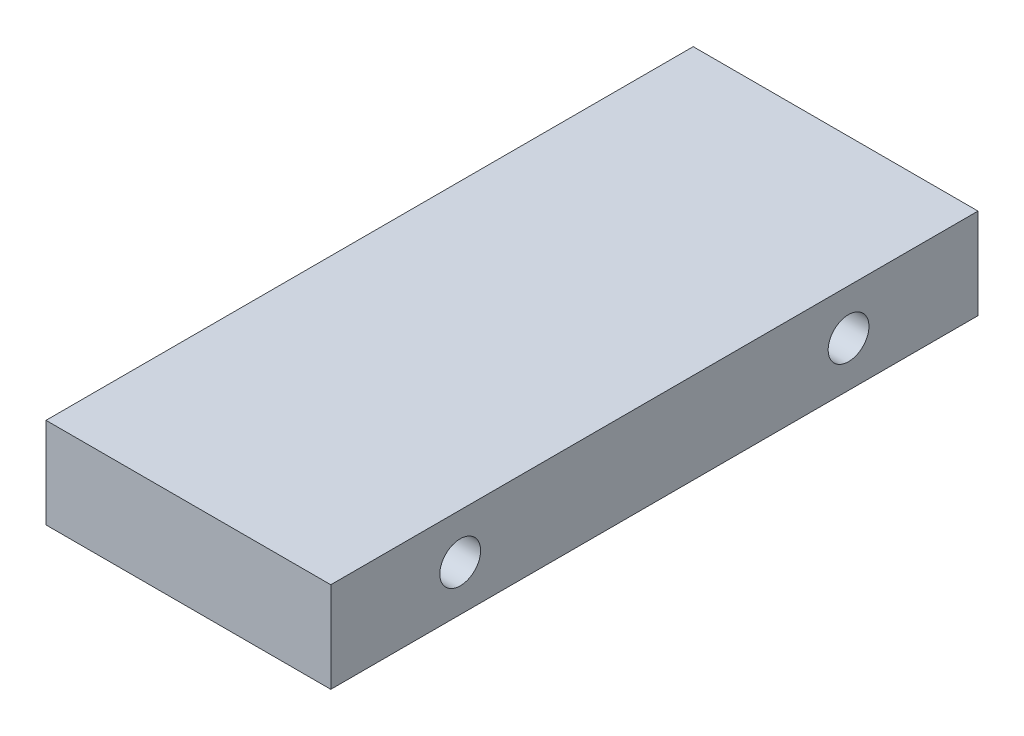
ISO-10303-21;
HEADER;
FILE_DESCRIPTION(('STEP AP214'),'2;1');
FILE_NAME('part.step','',(''),(''),'','','');
FILE_SCHEMA(('AUTOMOTIVE_DESIGN { 1 0 10303 214 1 1 1 1 }'));
ENDSEC;
DATA;
#1=APPLICATION_CONTEXT('core data for automotive mechanical design processes');
#2=APPLICATION_PROTOCOL_DEFINITION('international standard','automotive_design',2000,#1);
#3=PRODUCT_CONTEXT('',#1,'mechanical');
#4=PRODUCT('Part','Part','',(#3));
#5=PRODUCT_RELATED_PRODUCT_CATEGORY('part','',(#4));
#6=PRODUCT_DEFINITION_FORMATION('','',#4);
#7=PRODUCT_DEFINITION_CONTEXT('part definition',#1,'design');
#8=PRODUCT_DEFINITION('design','',#6,#7);
#9=PRODUCT_DEFINITION_SHAPE('','',#8);
#10=(LENGTH_UNIT() NAMED_UNIT(*) SI_UNIT(.MILLI.,.METRE.));
#11=(NAMED_UNIT(*) PLANE_ANGLE_UNIT() SI_UNIT($,.RADIAN.));
#12=(NAMED_UNIT(*) SI_UNIT($,.STERADIAN.) SOLID_ANGLE_UNIT());
#13=UNCERTAINTY_MEASURE_WITH_UNIT(LENGTH_MEASURE(1.E-05),#10,'distance_accuracy_value','');
#14=(GEOMETRIC_REPRESENTATION_CONTEXT(3) GLOBAL_UNCERTAINTY_ASSIGNED_CONTEXT((#13)) GLOBAL_UNIT_ASSIGNED_CONTEXT((#10,
#11,#12)) REPRESENTATION_CONTEXT('',''));
#15=CARTESIAN_POINT('',(0.,0.,0.));
#16=DIRECTION('',(0.,0.,1.));
#17=DIRECTION('',(1.,0.,0.));
#18=AXIS2_PLACEMENT_3D('',#15,#16,#17);
#19=CARTESIAN_POINT('',(22.,3.64364010352587,45.2762342197771));
#20=DIRECTION('',(0.,0.,-1.));
#21=DIRECTION('',(-1.,0.,0.));
#22=AXIS2_PLACEMENT_3D('',#19,#20,#21);
#23=PLANE('',#22);
#24=DIRECTION('',(0.,-1.,0.));
#25=VECTOR('',#24,1.);
#26=CARTESIAN_POINT('',(0.,3.64364010352587,45.2762342197771));
#27=LINE('',#26,#25);
#28=CARTESIAN_POINT('',(0.,3.64364010352587,45.2762342197771));
#29=VERTEX_POINT('',#28);
#30=CARTESIAN_POINT('',(0.,-3.35635989647414,45.2762342197771));
#31=VERTEX_POINT('',#30);
#32=EDGE_CURVE('E117',#29,#31,#27,.T.);
#33=ORIENTED_EDGE('',*,*,#32,.T.);
#34=DIRECTION('',(-1.,0.,0.));
#35=VECTOR('',#34,1.);
#36=CARTESIAN_POINT('',(22.,-3.35635989647414,45.2762342197771));
#37=LINE('',#36,#35);
#38=CARTESIAN_POINT('',(22.,-3.35635989647414,45.2762342197771));
#39=VERTEX_POINT('',#38);
#40=EDGE_CURVE('E11',#39,#31,#37,.T.);
#41=ORIENTED_EDGE('',*,*,#40,.F.);
#42=DIRECTION('',(0.,-1.,0.));
#43=VECTOR('',#42,1.);
#44=CARTESIAN_POINT('',(22.,3.64364010352587,45.2762342197771));
#45=LINE('',#44,#43);
#46=CARTESIAN_POINT('',(22.,3.64364010352587,45.2762342197771));
#47=VERTEX_POINT('',#46);
#48=EDGE_CURVE('E118',#47,#39,#45,.T.);
#49=ORIENTED_EDGE('',*,*,#48,.F.);
#50=DIRECTION('',(-1.,0.,0.));
#51=VECTOR('',#50,1.);
#52=CARTESIAN_POINT('',(22.,3.64364010352587,45.2762342197771));
#53=LINE('',#52,#51);
#54=EDGE_CURVE('E124',#47,#29,#53,.T.);
#55=ORIENTED_EDGE('',*,*,#54,.T.);
#56=EDGE_LOOP('',(#33,#41,#49,#55));
#57=FACE_BOUND('',#56,.T.);
#58=ADVANCED_FACE('F33',(#57),#23,.F.);
#59=CARTESIAN_POINT('',(22.,-3.35635989647414,45.2762342197771));
#60=DIRECTION('',(0.,1.,0.));
#61=DIRECTION('',(0.,0.,1.));
#62=AXIS2_PLACEMENT_3D('',#59,#60,#61);
#63=PLANE('',#62);
#64=DIRECTION('',(0.,0.,-1.));
#65=VECTOR('',#64,1.);
#66=CARTESIAN_POINT('',(0.,-3.35635989647414,45.2762342197771));
#67=LINE('',#66,#65);
#68=CARTESIAN_POINT('',(0.,-3.35635989647413,-4.72376578022288));
#69=VERTEX_POINT('',#68);
#70=EDGE_CURVE('E127',#31,#69,#67,.T.);
#71=ORIENTED_EDGE('',*,*,#70,.T.);
#72=DIRECTION('',(-1.,0.,0.));
#73=VECTOR('',#72,1.);
#74=CARTESIAN_POINT('',(22.,-3.35635989647413,-4.72376578022288));
#75=LINE('',#74,#73);
#76=CARTESIAN_POINT('',(22.,-3.35635989647413,-4.72376578022288));
#77=VERTEX_POINT('',#76);
#78=EDGE_CURVE('E41',#77,#69,#75,.T.);
#79=ORIENTED_EDGE('',*,*,#78,.F.);
#80=DIRECTION('',(0.,0.,-1.));
#81=VECTOR('',#80,1.);
#82=CARTESIAN_POINT('',(22.,-3.35635989647414,45.2762342197771));
#83=LINE('',#82,#81);
#84=EDGE_CURVE('E80',#39,#77,#83,.T.);
#85=ORIENTED_EDGE('',*,*,#84,.F.);
#86=ORIENTED_EDGE('',*,*,#40,.T.);
#87=EDGE_LOOP('',(#71,#79,#85,#86));
#88=FACE_BOUND('',#87,.T.);
#89=ADVANCED_FACE('F151',(#88),#63,.F.);
#90=CARTESIAN_POINT('',(22.,3.64364010352587,-4.72376578022288));
#91=DIRECTION('',(0.,0.,1.));
#92=DIRECTION('',(0.,-1.,0.));
#93=AXIS2_PLACEMENT_3D('',#90,#91,#92);
#94=PLANE('',#93);
#95=DIRECTION('',(0.,1.,0.));
#96=VECTOR('',#95,1.);
#97=CARTESIAN_POINT('',(0.,3.64364010352587,-4.72376578022288));
#98=LINE('',#97,#96);
#99=CARTESIAN_POINT('',(0.,3.64364010352587,-4.72376578022288));
#100=VERTEX_POINT('',#99);
#101=EDGE_CURVE('E67',#69,#100,#98,.T.);
#102=ORIENTED_EDGE('',*,*,#101,.T.);
#103=DIRECTION('',(-1.,0.,0.));
#104=VECTOR('',#103,1.);
#105=CARTESIAN_POINT('',(22.,3.64364010352587,-4.72376578022288));
#106=LINE('',#105,#104);
#107=CARTESIAN_POINT('',(22.,3.64364010352587,-4.72376578022288));
#108=VERTEX_POINT('',#107);
#109=EDGE_CURVE('E132',#108,#100,#106,.T.);
#110=ORIENTED_EDGE('',*,*,#109,.F.);
#111=DIRECTION('',(0.,1.,0.));
#112=VECTOR('',#111,1.);
#113=CARTESIAN_POINT('',(22.,3.64364010352587,-4.72376578022288));
#114=LINE('',#113,#112);
#115=EDGE_CURVE('E121',#77,#108,#114,.T.);
#116=ORIENTED_EDGE('',*,*,#115,.F.);
#117=ORIENTED_EDGE('',*,*,#78,.T.);
#118=EDGE_LOOP('',(#102,#110,#116,#117));
#119=FACE_BOUND('',#118,.T.);
#120=ADVANCED_FACE('F134',(#119),#94,.F.);
#121=CARTESIAN_POINT('',(22.,3.64364010352587,45.2762342197771));
#122=DIRECTION('',(0.,-1.,0.));
#123=DIRECTION('',(0.,0.,-1.));
#124=AXIS2_PLACEMENT_3D('',#121,#122,#123);
#125=PLANE('',#124);
#126=DIRECTION('',(0.,0.,1.));
#127=VECTOR('',#126,1.);
#128=CARTESIAN_POINT('',(0.,3.64364010352587,45.2762342197771));
#129=LINE('',#128,#127);
#130=EDGE_CURVE('E73',#100,#29,#129,.T.);
#131=ORIENTED_EDGE('',*,*,#130,.T.);
#132=ORIENTED_EDGE('',*,*,#54,.F.);
#133=DIRECTION('',(0.,0.,1.));
#134=VECTOR('',#133,1.);
#135=CARTESIAN_POINT('',(22.,3.64364010352587,45.2762342197771));
#136=LINE('',#135,#134);
#137=EDGE_CURVE('E49',#108,#47,#136,.T.);
#138=ORIENTED_EDGE('',*,*,#137,.F.);
#139=ORIENTED_EDGE('',*,*,#109,.T.);
#140=EDGE_LOOP('',(#131,#132,#138,#139));
#141=FACE_BOUND('',#140,.T.);
#142=ADVANCED_FACE('F141',(#141),#125,.F.);
#143=CARTESIAN_POINT('',(22.,0.,0.));
#144=DIRECTION('',(1.,0.,0.));
#145=DIRECTION('',(0.,0.,-1.));
#146=AXIS2_PLACEMENT_3D('',#143,#144,#145);
#147=PLANE('',#146);
#148=CARTESIAN_POINT('',(22.,0.143640103525865,35.2762342197771));
#149=DIRECTION('',(1.,0.,0.));
#150=DIRECTION('',(0.,0.,-1.));
#151=AXIS2_PLACEMENT_3D('',#148,#149,#150);
#152=CIRCLE('',#151,1.575);
#153=CARTESIAN_POINT('',(22.,0.143640103525865,33.7012342197771));
#154=VERTEX_POINT('',#153);
#155=EDGE_CURVE('E100',#154,#154,#152,.T.);
#156=ORIENTED_EDGE('',*,*,#155,.F.);
#157=EDGE_LOOP('',(#156));
#158=FACE_BOUND('',#157,.T.);
#159=CARTESIAN_POINT('',(22.,0.143640103525865,5.27623421977712));
#160=DIRECTION('',(1.,0.,0.));
#161=DIRECTION('',(0.,0.,-1.));
#162=AXIS2_PLACEMENT_3D('',#159,#160,#161);
#163=CIRCLE('',#162,1.575);
#164=CARTESIAN_POINT('',(22.,0.143640103525865,3.70123421977712));
#165=VERTEX_POINT('',#164);
#166=EDGE_CURVE('E111',#165,#165,#163,.T.);
#167=ORIENTED_EDGE('',*,*,#166,.F.);
#168=EDGE_LOOP('',(#167));
#169=FACE_BOUND('',#168,.T.);
#170=ORIENTED_EDGE('',*,*,#48,.T.);
#171=ORIENTED_EDGE('',*,*,#84,.T.);
#172=ORIENTED_EDGE('',*,*,#115,.T.);
#173=ORIENTED_EDGE('',*,*,#137,.T.);
#174=EDGE_LOOP('',(#170,#171,#172,#173));
#175=FACE_BOUND('',#174,.T.);
#176=ADVANCED_FACE('F143',(#158,#169,#175),#147,.T.);
#177=CARTESIAN_POINT('',(0.,0.,0.));
#178=DIRECTION('',(1.,0.,0.));
#179=DIRECTION('',(0.,0.,-1.));
#180=AXIS2_PLACEMENT_3D('',#177,#178,#179);
#181=PLANE('',#180);
#182=CARTESIAN_POINT('',(0.,0.143640103525865,20.2762342197771));
#183=DIRECTION('',(-1.,0.,0.));
#184=DIRECTION('',(0.,0.,1.));
#185=AXIS2_PLACEMENT_3D('',#182,#183,#184);
#186=CIRCLE('',#185,1.57499999999999);
#187=CARTESIAN_POINT('',(0.,0.143640103525865,21.8512342197771));
#188=VERTEX_POINT('',#187);
#189=EDGE_CURVE('E101',#188,#188,#186,.T.);
#190=ORIENTED_EDGE('',*,*,#189,.F.);
#191=EDGE_LOOP('',(#190));
#192=FACE_BOUND('',#191,.T.);
#193=ORIENTED_EDGE('',*,*,#32,.F.);
#194=ORIENTED_EDGE('',*,*,#130,.F.);
#195=ORIENTED_EDGE('',*,*,#101,.F.);
#196=ORIENTED_EDGE('',*,*,#70,.F.);
#197=EDGE_LOOP('',(#193,#194,#195,#196));
#198=FACE_BOUND('',#197,.T.);
#199=ADVANCED_FACE('F137',(#192,#198),#181,.F.);
#200=CARTESIAN_POINT('',(12.,0.143640103525865,5.27623421977712));
#201=DIRECTION('',(1.,0.,0.));
#202=DIRECTION('',(0.,0.,-1.));
#203=AXIS2_PLACEMENT_3D('',#200,#201,#202);
#204=CONICAL_SURFACE('',#203,1.575,1.02974425867665);
#205=CARTESIAN_POINT('',(11.0536445250316,0.143640103525862,5.27623421977712));
#206=VERTEX_POINT('',#205);
#207=VERTEX_LOOP('',#206);
#208=FACE_BOUND('',#207,.T.);
#209=CARTESIAN_POINT('',(12.,0.143640103525865,5.27623421977712));
#210=DIRECTION('',(1.,0.,0.));
#211=DIRECTION('',(0.,0.,-1.));
#212=AXIS2_PLACEMENT_3D('',#209,#210,#211);
#213=CIRCLE('',#212,1.575);
#214=CARTESIAN_POINT('',(12.,0.143640103525865,3.70123421977713));
#215=VERTEX_POINT('',#214);
#216=EDGE_CURVE('E114',#215,#215,#213,.T.);
#217=ORIENTED_EDGE('',*,*,#216,.T.);
#218=EDGE_LOOP('',(#217));
#219=FACE_BOUND('',#218,.T.);
#220=ADVANCED_FACE('F181',(#208,#219),#204,.F.);
#221=CARTESIAN_POINT('',(22.,0.143640103525865,5.27623421977712));
#222=DIRECTION('',(1.,0.,0.));
#223=DIRECTION('',(0.,0.,-1.));
#224=AXIS2_PLACEMENT_3D('',#221,#222,#223);
#225=CYLINDRICAL_SURFACE('',#224,1.575);
#226=ORIENTED_EDGE('',*,*,#216,.F.);
#227=EDGE_LOOP('',(#226));
#228=FACE_BOUND('',#227,.T.);
#229=ORIENTED_EDGE('',*,*,#166,.T.);
#230=EDGE_LOOP('',(#229));
#231=FACE_BOUND('',#230,.T.);
#232=ADVANCED_FACE('F186',(#228,#231),#225,.F.);
#233=CARTESIAN_POINT('',(12.,0.143640103525865,35.2762342197771));
#234=DIRECTION('',(1.,0.,0.));
#235=DIRECTION('',(0.,0.,-1.));
#236=AXIS2_PLACEMENT_3D('',#233,#234,#235);
#237=CONICAL_SURFACE('',#236,1.575,1.02974425867665);
#238=CARTESIAN_POINT('',(11.0536445250316,0.143640103525862,35.2762342197771));
#239=VERTEX_POINT('',#238);
#240=VERTEX_LOOP('',#239);
#241=FACE_BOUND('',#240,.T.);
#242=CARTESIAN_POINT('',(12.,0.143640103525865,35.2762342197771));
#243=DIRECTION('',(1.,0.,0.));
#244=DIRECTION('',(0.,0.,-1.));
#245=AXIS2_PLACEMENT_3D('',#242,#243,#244);
#246=CIRCLE('',#245,1.575);
#247=CARTESIAN_POINT('',(12.,0.143640103525865,33.7012342197771));
#248=VERTEX_POINT('',#247);
#249=EDGE_CURVE('E104',#248,#248,#246,.T.);
#250=ORIENTED_EDGE('',*,*,#249,.T.);
#251=EDGE_LOOP('',(#250));
#252=FACE_BOUND('',#251,.T.);
#253=ADVANCED_FACE('F196',(#241,#252),#237,.F.);
#254=CARTESIAN_POINT('',(22.,0.143640103525865,35.2762342197771));
#255=DIRECTION('',(1.,0.,0.));
#256=DIRECTION('',(0.,0.,-1.));
#257=AXIS2_PLACEMENT_3D('',#254,#255,#256);
#258=CYLINDRICAL_SURFACE('',#257,1.575);
#259=ORIENTED_EDGE('',*,*,#249,.F.);
#260=EDGE_LOOP('',(#259));
#261=FACE_BOUND('',#260,.T.);
#262=ORIENTED_EDGE('',*,*,#155,.T.);
#263=EDGE_LOOP('',(#262));
#264=FACE_BOUND('',#263,.T.);
#265=ADVANCED_FACE('F94',(#261,#264),#258,.F.);
#266=CARTESIAN_POINT('',(9.99999999999999,0.143640103525865,20.2762342197771));
#267=DIRECTION('',(-1.,0.,0.));
#268=DIRECTION('',(0.,0.,1.));
#269=AXIS2_PLACEMENT_3D('',#266,#267,#268);
#270=CONICAL_SURFACE('',#269,1.57499999999999,1.02974425867665);
#271=CARTESIAN_POINT('',(10.9463554749684,0.143640103525864,20.2762342197771));
#272=VERTEX_POINT('',#271);
#273=VERTEX_LOOP('',#272);
#274=FACE_BOUND('',#273,.T.);
#275=CARTESIAN_POINT('',(9.99999999999999,0.143640103525865,20.2762342197771));
#276=DIRECTION('',(-1.,0.,0.));
#277=DIRECTION('',(0.,0.,1.));
#278=AXIS2_PLACEMENT_3D('',#275,#276,#277);
#279=CIRCLE('',#278,1.57499999999999);
#280=CARTESIAN_POINT('',(9.99999999999999,0.143640103525865,21.8512342197771));
#281=VERTEX_POINT('',#280);
#282=EDGE_CURVE('E98',#281,#281,#279,.T.);
#283=ORIENTED_EDGE('',*,*,#282,.T.);
#284=EDGE_LOOP('',(#283));
#285=FACE_BOUND('',#284,.T.);
#286=ADVANCED_FACE('F90',(#274,#285),#270,.F.);
#287=CARTESIAN_POINT('',(0.,0.143640103525865,20.2762342197771));
#288=DIRECTION('',(-1.,0.,0.));
#289=DIRECTION('',(0.,0.,1.));
#290=AXIS2_PLACEMENT_3D('',#287,#288,#289);
#291=CYLINDRICAL_SURFACE('',#290,1.57499999999999);
#292=ORIENTED_EDGE('',*,*,#282,.F.);
#293=EDGE_LOOP('',(#292));
#294=FACE_BOUND('',#293,.T.);
#295=ORIENTED_EDGE('',*,*,#189,.T.);
#296=EDGE_LOOP('',(#295));
#297=FACE_BOUND('',#296,.T.);
#298=ADVANCED_FACE('F93',(#294,#297),#291,.F.);
#299=CLOSED_SHELL('',(#58,#89,#120,#142,#176,#199,#220,#232,#253,#265,#286,#298));
#300=MANIFOLD_SOLID_BREP('B2',#299);
#301=ADVANCED_BREP_SHAPE_REPRESENTATION('',(#18,#300),#14);
#302=SHAPE_DEFINITION_REPRESENTATION(#9,#301);
ENDSEC;
END-ISO-10303-21;
